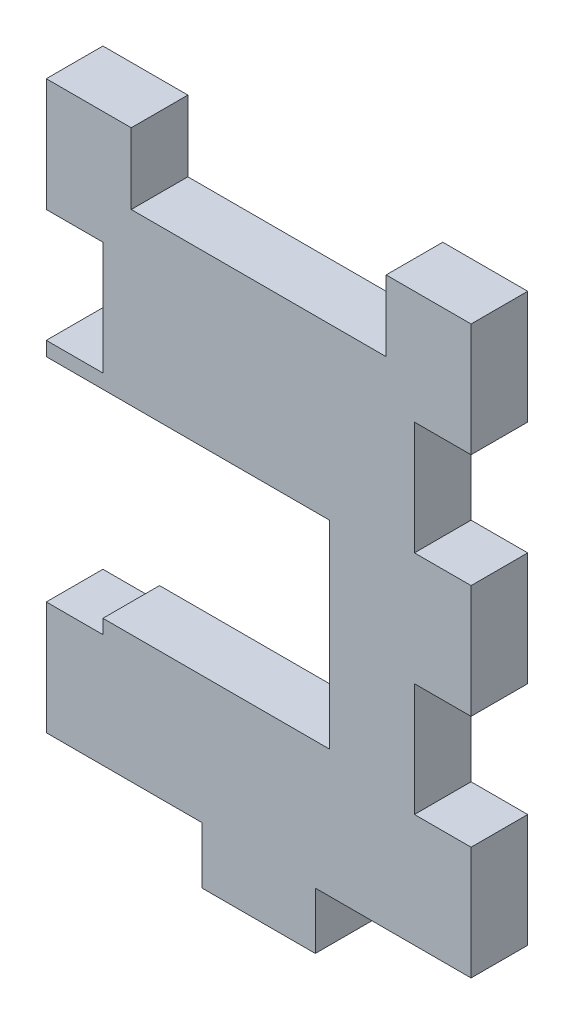
ISO-10303-21;
HEADER;
FILE_DESCRIPTION(('STEP AP214'),'2;1');
FILE_NAME('part.step','',(''),(''),'','','');
FILE_SCHEMA(('AUTOMOTIVE_DESIGN { 1 0 10303 214 1 1 1 1 }'));
ENDSEC;
DATA;
#1=APPLICATION_CONTEXT('core data for automotive mechanical design processes');
#2=APPLICATION_PROTOCOL_DEFINITION('international standard','automotive_design',2000,#1);
#3=PRODUCT_CONTEXT('',#1,'mechanical');
#4=PRODUCT('Part','Part','',(#3));
#5=PRODUCT_RELATED_PRODUCT_CATEGORY('part','',(#4));
#6=PRODUCT_DEFINITION_FORMATION('','',#4);
#7=PRODUCT_DEFINITION_CONTEXT('part definition',#1,'design');
#8=PRODUCT_DEFINITION('design','',#6,#7);
#9=PRODUCT_DEFINITION_SHAPE('','',#8);
#10=(LENGTH_UNIT() NAMED_UNIT(*) SI_UNIT(.MILLI.,.METRE.));
#11=(NAMED_UNIT(*) PLANE_ANGLE_UNIT() SI_UNIT($,.RADIAN.));
#12=(NAMED_UNIT(*) SI_UNIT($,.STERADIAN.) SOLID_ANGLE_UNIT());
#13=UNCERTAINTY_MEASURE_WITH_UNIT(LENGTH_MEASURE(1.E-05),#10,'distance_accuracy_value','');
#14=(GEOMETRIC_REPRESENTATION_CONTEXT(3) GLOBAL_UNCERTAINTY_ASSIGNED_CONTEXT((#13)) GLOBAL_UNIT_ASSIGNED_CONTEXT((#10,
#11,#12)) REPRESENTATION_CONTEXT('',''));
#15=CARTESIAN_POINT('',(0.,0.,0.));
#16=DIRECTION('',(0.,0.,1.));
#17=DIRECTION('',(1.,0.,0.));
#18=AXIS2_PLACEMENT_3D('',#15,#16,#17);
#19=CARTESIAN_POINT('',(0.,69.85,6.35));
#20=DIRECTION('',(0.,-1.,0.));
#21=DIRECTION('',(0.,0.,-1.));
#22=AXIS2_PLACEMENT_3D('',#19,#20,#21);
#23=PLANE('',#22);
#24=DIRECTION('',(-1.,0.,0.));
#25=VECTOR('',#24,1.);
#26=CARTESIAN_POINT('',(0.,69.85,0.));
#27=LINE('',#26,#25);
#28=CARTESIAN_POINT('',(47.625,69.85,0.));
#29=VERTEX_POINT('',#28);
#30=CARTESIAN_POINT('',(38.1,69.85,0.));
#31=VERTEX_POINT('',#30);
#32=EDGE_CURVE('E436',#29,#31,#27,.T.);
#33=ORIENTED_EDGE('',*,*,#32,.T.);
#34=DIRECTION('',(0.,0.,1.));
#35=VECTOR('',#34,1.);
#36=CARTESIAN_POINT('',(38.1,69.85,6.35));
#37=LINE('',#36,#35);
#38=CARTESIAN_POINT('',(38.1,69.85,6.35));
#39=VERTEX_POINT('',#38);
#40=EDGE_CURVE('E242',#31,#39,#37,.T.);
#41=ORIENTED_EDGE('',*,*,#40,.T.);
#42=DIRECTION('',(-1.,0.,0.));
#43=VECTOR('',#42,1.);
#44=CARTESIAN_POINT('',(0.,69.85,6.35));
#45=LINE('',#44,#43);
#46=CARTESIAN_POINT('',(47.625,69.85,6.35));
#47=VERTEX_POINT('',#46);
#48=EDGE_CURVE('E418',#47,#39,#45,.T.);
#49=ORIENTED_EDGE('',*,*,#48,.F.);
#50=DIRECTION('',(0.,0.,-1.));
#51=VECTOR('',#50,1.);
#52=CARTESIAN_POINT('',(47.625,69.85,6.35));
#53=LINE('',#52,#51);
#54=EDGE_CURVE('E440',#47,#29,#53,.T.);
#55=ORIENTED_EDGE('',*,*,#54,.T.);
#56=EDGE_LOOP('',(#33,#41,#49,#55));
#57=FACE_BOUND('',#56,.T.);
#58=ADVANCED_FACE('F33',(#57),#23,.F.);
#59=CARTESIAN_POINT('',(47.625,6.35000000000003,6.35));
#60=DIRECTION('',(-1.,0.,0.));
#61=DIRECTION('',(0.,-1.,0.));
#62=AXIS2_PLACEMENT_3D('',#59,#60,#61);
#63=PLANE('',#62);
#64=DIRECTION('',(0.,1.,0.));
#65=VECTOR('',#64,1.);
#66=CARTESIAN_POINT('',(47.625,6.35000000000003,0.));
#67=LINE('',#66,#65);
#68=CARTESIAN_POINT('',(47.625,31.75,0.));
#69=VERTEX_POINT('',#68);
#70=CARTESIAN_POINT('',(47.625,44.45,0.));
#71=VERTEX_POINT('',#70);
#72=EDGE_CURVE('E435',#69,#71,#67,.T.);
#73=ORIENTED_EDGE('',*,*,#72,.T.);
#74=DIRECTION('',(0.,0.,1.));
#75=VECTOR('',#74,1.);
#76=CARTESIAN_POINT('',(47.625,44.45,0.));
#77=LINE('',#76,#75);
#78=CARTESIAN_POINT('',(47.625,44.45,6.35));
#79=VERTEX_POINT('',#78);
#80=EDGE_CURVE('E301',#71,#79,#77,.T.);
#81=ORIENTED_EDGE('',*,*,#80,.T.);
#82=DIRECTION('',(0.,1.,0.));
#83=VECTOR('',#82,1.);
#84=CARTESIAN_POINT('',(47.625,6.35000000000003,6.35));
#85=LINE('',#84,#83);
#86=CARTESIAN_POINT('',(47.625,31.75,6.35));
#87=VERTEX_POINT('',#86);
#88=EDGE_CURVE('E417',#87,#79,#85,.T.);
#89=ORIENTED_EDGE('',*,*,#88,.F.);
#90=DIRECTION('',(0.,0.,1.));
#91=VECTOR('',#90,1.);
#92=CARTESIAN_POINT('',(47.625,31.75,0.));
#93=LINE('',#92,#91);
#94=EDGE_CURVE('E346',#69,#87,#93,.T.);
#95=ORIENTED_EDGE('',*,*,#94,.F.);
#96=EDGE_LOOP('',(#73,#81,#89,#95));
#97=FACE_BOUND('',#96,.T.);
#98=ADVANCED_FACE('F494',(#97),#63,.F.);
#99=CARTESIAN_POINT('',(0.,6.35000000000003,6.35));
#100=DIRECTION('',(1.,0.,0.));
#101=DIRECTION('',(0.,1.,0.));
#102=AXIS2_PLACEMENT_3D('',#99,#100,#101);
#103=PLANE('',#102);
#104=DIRECTION('',(0.,-1.,0.));
#105=VECTOR('',#104,1.);
#106=CARTESIAN_POINT('',(0.,6.35000000000003,0.));
#107=LINE('',#106,#105);
#108=CARTESIAN_POINT('',(0.,69.85,0.));
#109=VERTEX_POINT('',#108);
#110=CARTESIAN_POINT('',(0.,57.15,0.));
#111=VERTEX_POINT('',#110);
#112=EDGE_CURVE('E422',#109,#111,#107,.T.);
#113=ORIENTED_EDGE('',*,*,#112,.T.);
#114=DIRECTION('',(0.,0.,1.));
#115=VECTOR('',#114,1.);
#116=CARTESIAN_POINT('',(0.,57.15,0.));
#117=LINE('',#116,#115);
#118=CARTESIAN_POINT('',(0.,57.15,6.35));
#119=VERTEX_POINT('',#118);
#120=EDGE_CURVE('E327',#111,#119,#117,.T.);
#121=ORIENTED_EDGE('',*,*,#120,.T.);
#122=DIRECTION('',(0.,-1.,0.));
#123=VECTOR('',#122,1.);
#124=CARTESIAN_POINT('',(0.,6.35000000000003,6.35));
#125=LINE('',#124,#123);
#126=CARTESIAN_POINT('',(0.,69.85,6.35));
#127=VERTEX_POINT('',#126);
#128=EDGE_CURVE('E403',#127,#119,#125,.T.);
#129=ORIENTED_EDGE('',*,*,#128,.F.);
#130=DIRECTION('',(0.,0.,-1.));
#131=VECTOR('',#130,1.);
#132=CARTESIAN_POINT('',(0.,69.85,6.35));
#133=LINE('',#132,#131);
#134=EDGE_CURVE('E421',#127,#109,#133,.T.);
#135=ORIENTED_EDGE('',*,*,#134,.T.);
#136=EDGE_LOOP('',(#113,#121,#129,#135));
#137=FACE_BOUND('',#136,.T.);
#138=ADVANCED_FACE('F503',(#137),#103,.F.);
#139=CARTESIAN_POINT('',(47.625,6.35000000000003,0.));
#140=VERTEX_POINT('',#139);
#141=CARTESIAN_POINT('',(47.625,19.05,0.));
#142=VERTEX_POINT('',#141);
#143=EDGE_CURVE('E431',#140,#142,#67,.T.);
#144=ORIENTED_EDGE('',*,*,#143,.T.);
#145=DIRECTION('',(0.,0.,1.));
#146=VECTOR('',#145,1.);
#147=CARTESIAN_POINT('',(47.625,19.05,0.));
#148=LINE('',#147,#146);
#149=CARTESIAN_POINT('',(47.625,19.05,6.35));
#150=VERTEX_POINT('',#149);
#151=EDGE_CURVE('E353',#142,#150,#148,.T.);
#152=ORIENTED_EDGE('',*,*,#151,.T.);
#153=CARTESIAN_POINT('',(47.625,6.35000000000003,6.35));
#154=VERTEX_POINT('',#153);
#155=EDGE_CURVE('E413',#154,#150,#85,.T.);
#156=ORIENTED_EDGE('',*,*,#155,.F.);
#157=DIRECTION('',(0.,0.,-1.));
#158=VECTOR('',#157,1.);
#159=CARTESIAN_POINT('',(47.625,6.35000000000003,6.35));
#160=LINE('',#159,#158);
#161=EDGE_CURVE('E443',#154,#140,#160,.T.);
#162=ORIENTED_EDGE('',*,*,#161,.T.);
#163=EDGE_LOOP('',(#144,#152,#156,#162));
#164=FACE_BOUND('',#163,.T.);
#165=ADVANCED_FACE('F506',(#164),#63,.F.);
#166=CARTESIAN_POINT('',(0.,44.45,0.));
#167=VERTEX_POINT('',#166);
#168=CARTESIAN_POINT('',(0.,42.8625,0.));
#169=VERTEX_POINT('',#168);
#170=EDGE_CURVE('E426',#167,#169,#107,.T.);
#171=ORIENTED_EDGE('',*,*,#170,.T.);
#172=DIRECTION('',(0.,0.,1.));
#173=VECTOR('',#172,1.);
#174=CARTESIAN_POINT('',(0.,42.8625,6.35));
#175=LINE('',#174,#173);
#176=CARTESIAN_POINT('',(0.,42.8625,6.35));
#177=VERTEX_POINT('',#176);
#178=EDGE_CURVE('E279',#169,#177,#175,.T.);
#179=ORIENTED_EDGE('',*,*,#178,.T.);
#180=CARTESIAN_POINT('',(0.,44.45,6.35));
#181=VERTEX_POINT('',#180);
#182=EDGE_CURVE('E407',#181,#177,#125,.T.);
#183=ORIENTED_EDGE('',*,*,#182,.F.);
#184=DIRECTION('',(0.,0.,1.));
#185=VECTOR('',#184,1.);
#186=CARTESIAN_POINT('',(0.,44.45,0.));
#187=LINE('',#186,#185);
#188=EDGE_CURVE('E320',#167,#181,#187,.T.);
#189=ORIENTED_EDGE('',*,*,#188,.F.);
#190=EDGE_LOOP('',(#171,#179,#183,#189));
#191=FACE_BOUND('',#190,.T.);
#192=ADVANCED_FACE('F474',(#191),#103,.F.);
#193=CARTESIAN_POINT('',(0.,6.35000000000003,6.35));
#194=DIRECTION('',(0.,1.,0.));
#195=DIRECTION('',(0.,0.,1.));
#196=AXIS2_PLACEMENT_3D('',#193,#194,#195);
#197=PLANE('',#196);
#198=DIRECTION('',(1.,0.,0.));
#199=VECTOR('',#198,1.);
#200=CARTESIAN_POINT('',(0.,6.35000000000003,0.));
#201=LINE('',#200,#199);
#202=CARTESIAN_POINT('',(0.,6.35000000000003,0.));
#203=VERTEX_POINT('',#202);
#204=CARTESIAN_POINT('',(17.4625,6.35000000000003,0.));
#205=VERTEX_POINT('',#204);
#206=EDGE_CURVE('E427',#203,#205,#201,.T.);
#207=ORIENTED_EDGE('',*,*,#206,.T.);
#208=DIRECTION('',(0.,0.,1.));
#209=VECTOR('',#208,1.);
#210=CARTESIAN_POINT('',(17.4625,6.35000000000003,6.35));
#211=LINE('',#210,#209);
#212=CARTESIAN_POINT('',(17.4625,6.35000000000003,6.35));
#213=VERTEX_POINT('',#212);
#214=EDGE_CURVE('E399',#205,#213,#211,.T.);
#215=ORIENTED_EDGE('',*,*,#214,.T.);
#216=DIRECTION('',(1.,0.,0.));
#217=VECTOR('',#216,1.);
#218=CARTESIAN_POINT('',(0.,6.35000000000003,6.35));
#219=LINE('',#218,#217);
#220=CARTESIAN_POINT('',(0.,6.35000000000003,6.35));
#221=VERTEX_POINT('',#220);
#222=EDGE_CURVE('E409',#221,#213,#219,.T.);
#223=ORIENTED_EDGE('',*,*,#222,.F.);
#224=DIRECTION('',(0.,0.,-1.));
#225=VECTOR('',#224,1.);
#226=CARTESIAN_POINT('',(0.,6.35000000000003,6.35));
#227=LINE('',#226,#225);
#228=EDGE_CURVE('E446',#221,#203,#227,.T.);
#229=ORIENTED_EDGE('',*,*,#228,.T.);
#230=EDGE_LOOP('',(#207,#215,#223,#229));
#231=FACE_BOUND('',#230,.T.);
#232=ADVANCED_FACE('F575',(#231),#197,.F.);
#233=CARTESIAN_POINT('',(0.,19.05,6.35));
#234=VERTEX_POINT('',#233);
#235=EDGE_CURVE('E408',#234,#221,#125,.T.);
#236=ORIENTED_EDGE('',*,*,#235,.F.);
#237=DIRECTION('',(0.,0.,1.));
#238=VECTOR('',#237,1.);
#239=CARTESIAN_POINT('',(0.,19.05,0.));
#240=LINE('',#239,#238);
#241=CARTESIAN_POINT('',(0.,19.05,0.));
#242=VERTEX_POINT('',#241);
#243=EDGE_CURVE('E369',#242,#234,#240,.T.);
#244=ORIENTED_EDGE('',*,*,#243,.F.);
#245=EDGE_CURVE('E402',#242,#203,#107,.T.);
#246=ORIENTED_EDGE('',*,*,#245,.T.);
#247=ORIENTED_EDGE('',*,*,#228,.F.);
#248=EDGE_LOOP('',(#236,#244,#246,#247));
#249=FACE_BOUND('',#248,.T.);
#250=ADVANCED_FACE('F35',(#249),#103,.F.);
#251=CARTESIAN_POINT('',(30.1625,6.35000000000003,6.35));
#252=VERTEX_POINT('',#251);
#253=EDGE_CURVE('E406',#252,#154,#219,.T.);
#254=ORIENTED_EDGE('',*,*,#253,.F.);
#255=DIRECTION('',(0.,0.,-1.));
#256=VECTOR('',#255,1.);
#257=CARTESIAN_POINT('',(30.1625,6.35000000000003,6.35));
#258=LINE('',#257,#256);
#259=CARTESIAN_POINT('',(30.1625,6.35000000000003,0.));
#260=VERTEX_POINT('',#259);
#261=EDGE_CURVE('E394',#252,#260,#258,.T.);
#262=ORIENTED_EDGE('',*,*,#261,.T.);
#263=EDGE_CURVE('E425',#260,#140,#201,.T.);
#264=ORIENTED_EDGE('',*,*,#263,.T.);
#265=ORIENTED_EDGE('',*,*,#161,.F.);
#266=EDGE_LOOP('',(#254,#262,#264,#265));
#267=FACE_BOUND('',#266,.T.);
#268=ADVANCED_FACE('F515',(#267),#197,.F.);
#269=CARTESIAN_POINT('',(47.625,57.15,6.35));
#270=VERTEX_POINT('',#269);
#271=EDGE_CURVE('E412',#270,#47,#85,.T.);
#272=ORIENTED_EDGE('',*,*,#271,.F.);
#273=DIRECTION('',(0.,0.,1.));
#274=VECTOR('',#273,1.);
#275=CARTESIAN_POINT('',(47.625,57.15,0.));
#276=LINE('',#275,#274);
#277=CARTESIAN_POINT('',(47.625,57.15,0.));
#278=VERTEX_POINT('',#277);
#279=EDGE_CURVE('E294',#278,#270,#276,.T.);
#280=ORIENTED_EDGE('',*,*,#279,.F.);
#281=EDGE_CURVE('E430',#278,#29,#67,.T.);
#282=ORIENTED_EDGE('',*,*,#281,.T.);
#283=ORIENTED_EDGE('',*,*,#54,.F.);
#284=EDGE_LOOP('',(#272,#280,#282,#283));
#285=FACE_BOUND('',#284,.T.);
#286=ADVANCED_FACE('F507',(#285),#63,.F.);
#287=CARTESIAN_POINT('',(9.525,69.85,6.35));
#288=VERTEX_POINT('',#287);
#289=EDGE_CURVE('E416',#288,#127,#45,.T.);
#290=ORIENTED_EDGE('',*,*,#289,.F.);
#291=DIRECTION('',(0.,0.,-1.));
#292=VECTOR('',#291,1.);
#293=CARTESIAN_POINT('',(9.525,69.85,6.35));
#294=LINE('',#293,#292);
#295=CARTESIAN_POINT('',(9.525,69.85,0.));
#296=VERTEX_POINT('',#295);
#297=EDGE_CURVE('E235',#288,#296,#294,.T.);
#298=ORIENTED_EDGE('',*,*,#297,.T.);
#299=EDGE_CURVE('E434',#296,#109,#27,.T.);
#300=ORIENTED_EDGE('',*,*,#299,.T.);
#301=ORIENTED_EDGE('',*,*,#134,.F.);
#302=EDGE_LOOP('',(#290,#298,#300,#301));
#303=FACE_BOUND('',#302,.T.);
#304=ADVANCED_FACE('F497',(#303),#23,.F.);
#305=CARTESIAN_POINT('',(0.,0.,6.35));
#306=DIRECTION('',(0.,0.,-1.));
#307=DIRECTION('',(-1.,0.,0.));
#308=AXIS2_PLACEMENT_3D('',#305,#306,#307);
#309=PLANE('',#308);
#310=ORIENTED_EDGE('',*,*,#48,.T.);
#311=DIRECTION('',(0.,1.,0.));
#312=VECTOR('',#311,1.);
#313=CARTESIAN_POINT('',(38.1,61.9125,6.35));
#314=LINE('',#313,#312);
#315=CARTESIAN_POINT('',(38.1,61.9125,6.35));
#316=VERTEX_POINT('',#315);
#317=EDGE_CURVE('E253',#316,#39,#314,.T.);
#318=ORIENTED_EDGE('',*,*,#317,.F.);
#319=DIRECTION('',(1.,0.,0.));
#320=VECTOR('',#319,1.);
#321=CARTESIAN_POINT('',(9.525,61.9125,6.35));
#322=LINE('',#321,#320);
#323=CARTESIAN_POINT('',(9.525,61.9125,6.35));
#324=VERTEX_POINT('',#323);
#325=EDGE_CURVE('E232',#324,#316,#322,.T.);
#326=ORIENTED_EDGE('',*,*,#325,.F.);
#327=DIRECTION('',(0.,-1.,0.));
#328=VECTOR('',#327,1.);
#329=CARTESIAN_POINT('',(9.525,61.9125,6.35));
#330=LINE('',#329,#328);
#331=EDGE_CURVE('E255',#288,#324,#330,.T.);
#332=ORIENTED_EDGE('',*,*,#331,.F.);
#333=ORIENTED_EDGE('',*,*,#289,.T.);
#334=ORIENTED_EDGE('',*,*,#128,.T.);
#335=DIRECTION('',(-1.,0.,0.));
#336=VECTOR('',#335,1.);
#337=CARTESIAN_POINT('',(0.,57.15,6.35));
#338=LINE('',#337,#336);
#339=CARTESIAN_POINT('',(6.35,57.15,6.35));
#340=VERTEX_POINT('',#339);
#341=EDGE_CURVE('E314',#340,#119,#338,.T.);
#342=ORIENTED_EDGE('',*,*,#341,.F.);
#343=DIRECTION('',(0.,1.,0.));
#344=VECTOR('',#343,1.);
#345=CARTESIAN_POINT('',(6.35,44.45,6.35));
#346=LINE('',#345,#344);
#347=CARTESIAN_POINT('',(6.35,44.45,6.35));
#348=VERTEX_POINT('',#347);
#349=EDGE_CURVE('E323',#348,#340,#346,.T.);
#350=ORIENTED_EDGE('',*,*,#349,.F.);
#351=DIRECTION('',(1.,0.,0.));
#352=VECTOR('',#351,1.);
#353=CARTESIAN_POINT('',(0.,44.45,6.35));
#354=LINE('',#353,#352);
#355=EDGE_CURVE('E304',#181,#348,#354,.T.);
#356=ORIENTED_EDGE('',*,*,#355,.F.);
#357=ORIENTED_EDGE('',*,*,#182,.T.);
#358=DIRECTION('',(-1.,0.,0.));
#359=VECTOR('',#358,1.);
#360=CARTESIAN_POINT('',(-19.05,42.8625,6.35));
#361=LINE('',#360,#359);
#362=CARTESIAN_POINT('',(31.75,42.8625,6.35));
#363=VERTEX_POINT('',#362);
#364=EDGE_CURVE('E273',#363,#177,#361,.T.);
#365=ORIENTED_EDGE('',*,*,#364,.F.);
#366=DIRECTION('',(0.,1.,0.));
#367=VECTOR('',#366,1.);
#368=CARTESIAN_POINT('',(31.75,20.6375,6.35));
#369=LINE('',#368,#367);
#370=CARTESIAN_POINT('',(31.75,20.6375,6.35));
#371=VERTEX_POINT('',#370);
#372=EDGE_CURVE('E261',#371,#363,#369,.T.);
#373=ORIENTED_EDGE('',*,*,#372,.F.);
#374=DIRECTION('',(1.,0.,0.));
#375=VECTOR('',#374,1.);
#376=CARTESIAN_POINT('',(-19.05,20.6375,6.35));
#377=LINE('',#376,#375);
#378=CARTESIAN_POINT('',(6.35,20.6375,6.35));
#379=VERTEX_POINT('',#378);
#380=EDGE_CURVE('E266',#379,#371,#377,.T.);
#381=ORIENTED_EDGE('',*,*,#380,.F.);
#382=DIRECTION('',(0.,1.,0.));
#383=VECTOR('',#382,1.);
#384=CARTESIAN_POINT('',(6.35,19.05,6.35));
#385=LINE('',#384,#383);
#386=CARTESIAN_POINT('',(6.35,19.05,6.35));
#387=VERTEX_POINT('',#386);
#388=EDGE_CURVE('E366',#387,#379,#385,.T.);
#389=ORIENTED_EDGE('',*,*,#388,.F.);
#390=DIRECTION('',(1.,0.,0.));
#391=VECTOR('',#390,1.);
#392=CARTESIAN_POINT('',(0.,19.05,6.35));
#393=LINE('',#392,#391);
#394=EDGE_CURVE('E356',#234,#387,#393,.T.);
#395=ORIENTED_EDGE('',*,*,#394,.F.);
#396=ORIENTED_EDGE('',*,*,#235,.T.);
#397=ORIENTED_EDGE('',*,*,#222,.T.);
#398=DIRECTION('',(0.,-1.,0.));
#399=VECTOR('',#398,1.);
#400=CARTESIAN_POINT('',(17.4625,0.,6.35));
#401=LINE('',#400,#399);
#402=CARTESIAN_POINT('',(17.4625,0.,6.35));
#403=VERTEX_POINT('',#402);
#404=EDGE_CURVE('E376',#213,#403,#401,.T.);
#405=ORIENTED_EDGE('',*,*,#404,.T.);
#406=DIRECTION('',(1.,0.,0.));
#407=VECTOR('',#406,1.);
#408=CARTESIAN_POINT('',(30.1625,0.,6.35));
#409=LINE('',#408,#407);
#410=CARTESIAN_POINT('',(30.1625,0.,6.35));
#411=VERTEX_POINT('',#410);
#412=EDGE_CURVE('E388',#403,#411,#409,.T.);
#413=ORIENTED_EDGE('',*,*,#412,.T.);
#414=DIRECTION('',(0.,1.,0.));
#415=VECTOR('',#414,1.);
#416=CARTESIAN_POINT('',(30.1625,0.,6.35));
#417=LINE('',#416,#415);
#418=EDGE_CURVE('E381',#411,#252,#417,.T.);
#419=ORIENTED_EDGE('',*,*,#418,.T.);
#420=ORIENTED_EDGE('',*,*,#253,.T.);
#421=ORIENTED_EDGE('',*,*,#155,.T.);
#422=DIRECTION('',(1.,0.,0.));
#423=VECTOR('',#422,1.);
#424=CARTESIAN_POINT('',(47.625,19.05,6.35));
#425=LINE('',#424,#423);
#426=CARTESIAN_POINT('',(41.275,19.05,6.35));
#427=VERTEX_POINT('',#426);
#428=EDGE_CURVE('E340',#427,#150,#425,.T.);
#429=ORIENTED_EDGE('',*,*,#428,.F.);
#430=DIRECTION('',(0.,-1.,0.));
#431=VECTOR('',#430,1.);
#432=CARTESIAN_POINT('',(41.275,19.05,6.35));
#433=LINE('',#432,#431);
#434=CARTESIAN_POINT('',(41.275,31.75,6.35));
#435=VERTEX_POINT('',#434);
#436=EDGE_CURVE('E349',#435,#427,#433,.T.);
#437=ORIENTED_EDGE('',*,*,#436,.F.);
#438=DIRECTION('',(-1.,0.,0.));
#439=VECTOR('',#438,1.);
#440=CARTESIAN_POINT('',(47.625,31.75,6.35));
#441=LINE('',#440,#439);
#442=EDGE_CURVE('E330',#87,#435,#441,.T.);
#443=ORIENTED_EDGE('',*,*,#442,.F.);
#444=ORIENTED_EDGE('',*,*,#88,.T.);
#445=DIRECTION('',(1.,0.,0.));
#446=VECTOR('',#445,1.);
#447=CARTESIAN_POINT('',(47.625,44.45,6.35));
#448=LINE('',#447,#446);
#449=CARTESIAN_POINT('',(41.275,44.45,6.35));
#450=VERTEX_POINT('',#449);
#451=EDGE_CURVE('E288',#450,#79,#448,.T.);
#452=ORIENTED_EDGE('',*,*,#451,.F.);
#453=DIRECTION('',(0.,-1.,0.));
#454=VECTOR('',#453,1.);
#455=CARTESIAN_POINT('',(41.275,44.45,6.35));
#456=LINE('',#455,#454);
#457=CARTESIAN_POINT('',(41.275,57.15,6.35));
#458=VERTEX_POINT('',#457);
#459=EDGE_CURVE('E297',#458,#450,#456,.T.);
#460=ORIENTED_EDGE('',*,*,#459,.F.);
#461=DIRECTION('',(-1.,0.,0.));
#462=VECTOR('',#461,1.);
#463=CARTESIAN_POINT('',(47.625,57.15,6.35));
#464=LINE('',#463,#462);
#465=EDGE_CURVE('E283',#270,#458,#464,.T.);
#466=ORIENTED_EDGE('',*,*,#465,.F.);
#467=ORIENTED_EDGE('',*,*,#271,.T.);
#468=EDGE_LOOP('',(#310,#318,#326,#332,#333,#334,#342,#350,#356,#357,#365,#373,#381,#389,#395,
#396,#397,#405,#413,#419,#420,#421,#429,#437,#443,#444,#452,#460,#466,#467));
#469=FACE_BOUND('',#468,.T.);
#470=ADVANCED_FACE('F468',(#469),#309,.F.);
#471=CARTESIAN_POINT('',(0.,0.,0.));
#472=DIRECTION('',(0.,0.,-1.));
#473=DIRECTION('',(-1.,0.,0.));
#474=AXIS2_PLACEMENT_3D('',#471,#472,#473);
#475=PLANE('',#474);
#476=DIRECTION('',(0.,1.,0.));
#477=VECTOR('',#476,1.);
#478=CARTESIAN_POINT('',(38.1,61.9125,0.));
#479=LINE('',#478,#477);
#480=CARTESIAN_POINT('',(38.1,61.9125,0.));
#481=VERTEX_POINT('',#480);
#482=EDGE_CURVE('E239',#481,#31,#479,.T.);
#483=ORIENTED_EDGE('',*,*,#482,.T.);
#484=ORIENTED_EDGE('',*,*,#32,.F.);
#485=ORIENTED_EDGE('',*,*,#281,.F.);
#486=DIRECTION('',(-1.,0.,0.));
#487=VECTOR('',#486,1.);
#488=CARTESIAN_POINT('',(47.625,57.15,0.));
#489=LINE('',#488,#487);
#490=CARTESIAN_POINT('',(41.275,57.15,0.));
#491=VERTEX_POINT('',#490);
#492=EDGE_CURVE('E284',#278,#491,#489,.T.);
#493=ORIENTED_EDGE('',*,*,#492,.T.);
#494=DIRECTION('',(0.,-1.,0.));
#495=VECTOR('',#494,1.);
#496=CARTESIAN_POINT('',(41.275,44.45,0.));
#497=LINE('',#496,#495);
#498=CARTESIAN_POINT('',(41.275,44.45,0.));
#499=VERTEX_POINT('',#498);
#500=EDGE_CURVE('E287',#491,#499,#497,.T.);
#501=ORIENTED_EDGE('',*,*,#500,.T.);
#502=DIRECTION('',(1.,0.,0.));
#503=VECTOR('',#502,1.);
#504=CARTESIAN_POINT('',(47.625,44.45,0.));
#505=LINE('',#504,#503);
#506=EDGE_CURVE('E291',#499,#71,#505,.T.);
#507=ORIENTED_EDGE('',*,*,#506,.T.);
#508=ORIENTED_EDGE('',*,*,#72,.F.);
#509=DIRECTION('',(-1.,0.,0.));
#510=VECTOR('',#509,1.);
#511=CARTESIAN_POINT('',(47.625,31.75,0.));
#512=LINE('',#511,#510);
#513=CARTESIAN_POINT('',(41.275,31.75,0.));
#514=VERTEX_POINT('',#513);
#515=EDGE_CURVE('E336',#69,#514,#512,.T.);
#516=ORIENTED_EDGE('',*,*,#515,.T.);
#517=DIRECTION('',(0.,-1.,0.));
#518=VECTOR('',#517,1.);
#519=CARTESIAN_POINT('',(41.275,19.05,0.));
#520=LINE('',#519,#518);
#521=CARTESIAN_POINT('',(41.275,19.05,0.));
#522=VERTEX_POINT('',#521);
#523=EDGE_CURVE('E339',#514,#522,#520,.T.);
#524=ORIENTED_EDGE('',*,*,#523,.T.);
#525=DIRECTION('',(1.,0.,0.));
#526=VECTOR('',#525,1.);
#527=CARTESIAN_POINT('',(47.625,19.05,0.));
#528=LINE('',#527,#526);
#529=EDGE_CURVE('E343',#522,#142,#528,.T.);
#530=ORIENTED_EDGE('',*,*,#529,.T.);
#531=ORIENTED_EDGE('',*,*,#143,.F.);
#532=ORIENTED_EDGE('',*,*,#263,.F.);
#533=DIRECTION('',(0.,1.,0.));
#534=VECTOR('',#533,1.);
#535=CARTESIAN_POINT('',(30.1625,0.,0.));
#536=LINE('',#535,#534);
#537=CARTESIAN_POINT('',(30.1625,0.,0.));
#538=VERTEX_POINT('',#537);
#539=EDGE_CURVE('E384',#538,#260,#536,.T.);
#540=ORIENTED_EDGE('',*,*,#539,.F.);
#541=DIRECTION('',(1.,0.,0.));
#542=VECTOR('',#541,1.);
#543=CARTESIAN_POINT('',(30.1625,0.,0.));
#544=LINE('',#543,#542);
#545=CARTESIAN_POINT('',(17.4625,0.,0.));
#546=VERTEX_POINT('',#545);
#547=EDGE_CURVE('E380',#546,#538,#544,.T.);
#548=ORIENTED_EDGE('',*,*,#547,.F.);
#549=DIRECTION('',(0.,-1.,0.));
#550=VECTOR('',#549,1.);
#551=CARTESIAN_POINT('',(17.4625,0.,0.));
#552=LINE('',#551,#550);
#553=EDGE_CURVE('E378',#205,#546,#552,.T.);
#554=ORIENTED_EDGE('',*,*,#553,.F.);
#555=ORIENTED_EDGE('',*,*,#206,.F.);
#556=ORIENTED_EDGE('',*,*,#245,.F.);
#557=DIRECTION('',(1.,0.,0.));
#558=VECTOR('',#557,1.);
#559=CARTESIAN_POINT('',(0.,19.05,0.));
#560=LINE('',#559,#558);
#561=CARTESIAN_POINT('',(6.35,19.05,0.));
#562=VERTEX_POINT('',#561);
#563=EDGE_CURVE('E362',#242,#562,#560,.T.);
#564=ORIENTED_EDGE('',*,*,#563,.T.);
#565=DIRECTION('',(0.,1.,0.));
#566=VECTOR('',#565,1.);
#567=CARTESIAN_POINT('',(6.35,19.05,0.));
#568=LINE('',#567,#566);
#569=CARTESIAN_POINT('',(6.35,20.6375,0.));
#570=VERTEX_POINT('',#569);
#571=EDGE_CURVE('E365',#562,#570,#568,.T.);
#572=ORIENTED_EDGE('',*,*,#571,.T.);
#573=DIRECTION('',(1.,0.,0.));
#574=VECTOR('',#573,1.);
#575=CARTESIAN_POINT('',(-19.05,20.6375,0.));
#576=LINE('',#575,#574);
#577=CARTESIAN_POINT('',(31.75,20.6375,0.));
#578=VERTEX_POINT('',#577);
#579=EDGE_CURVE('E56',#570,#578,#576,.T.);
#580=ORIENTED_EDGE('',*,*,#579,.T.);
#581=DIRECTION('',(0.,1.,0.));
#582=VECTOR('',#581,1.);
#583=CARTESIAN_POINT('',(31.75,20.6375,0.));
#584=LINE('',#583,#582);
#585=CARTESIAN_POINT('',(31.75,42.8625,0.));
#586=VERTEX_POINT('',#585);
#587=EDGE_CURVE('E262',#578,#586,#584,.T.);
#588=ORIENTED_EDGE('',*,*,#587,.T.);
#589=DIRECTION('',(-1.,0.,0.));
#590=VECTOR('',#589,1.);
#591=CARTESIAN_POINT('',(-19.05,42.8625,0.));
#592=LINE('',#591,#590);
#593=EDGE_CURVE('E265',#586,#169,#592,.T.);
#594=ORIENTED_EDGE('',*,*,#593,.T.);
#595=ORIENTED_EDGE('',*,*,#170,.F.);
#596=DIRECTION('',(1.,0.,0.));
#597=VECTOR('',#596,1.);
#598=CARTESIAN_POINT('',(0.,44.45,0.));
#599=LINE('',#598,#597);
#600=CARTESIAN_POINT('',(6.35,44.45,0.));
#601=VERTEX_POINT('',#600);
#602=EDGE_CURVE('E310',#167,#601,#599,.T.);
#603=ORIENTED_EDGE('',*,*,#602,.T.);
#604=DIRECTION('',(0.,1.,0.));
#605=VECTOR('',#604,1.);
#606=CARTESIAN_POINT('',(6.35,44.45,0.));
#607=LINE('',#606,#605);
#608=CARTESIAN_POINT('',(6.35,57.15,0.));
#609=VERTEX_POINT('',#608);
#610=EDGE_CURVE('E313',#601,#609,#607,.T.);
#611=ORIENTED_EDGE('',*,*,#610,.T.);
#612=DIRECTION('',(-1.,0.,0.));
#613=VECTOR('',#612,1.);
#614=CARTESIAN_POINT('',(0.,57.15,0.));
#615=LINE('',#614,#613);
#616=EDGE_CURVE('E317',#609,#111,#615,.T.);
#617=ORIENTED_EDGE('',*,*,#616,.T.);
#618=ORIENTED_EDGE('',*,*,#112,.F.);
#619=ORIENTED_EDGE('',*,*,#299,.F.);
#620=DIRECTION('',(0.,1.,0.));
#621=VECTOR('',#620,1.);
#622=CARTESIAN_POINT('',(9.525,0.,0.));
#623=LINE('',#622,#621);
#624=CARTESIAN_POINT('',(9.525,61.9125,0.));
#625=VERTEX_POINT('',#624);
#626=EDGE_CURVE('E11',#625,#296,#623,.T.);
#627=ORIENTED_EDGE('',*,*,#626,.F.);
#628=DIRECTION('',(1.,0.,0.));
#629=VECTOR('',#628,1.);
#630=CARTESIAN_POINT('',(9.525,61.9125,0.));
#631=LINE('',#630,#629);
#632=EDGE_CURVE('E48',#625,#481,#631,.T.);
#633=ORIENTED_EDGE('',*,*,#632,.T.);
#634=EDGE_LOOP('',(#483,#484,#485,#493,#501,#507,#508,#516,#524,#530,#531,#532,#540,#548,#554,
#555,#556,#564,#572,#580,#588,#594,#595,#603,#611,#617,#618,#619,#627,#633));
#635=FACE_BOUND('',#634,.T.);
#636=ADVANCED_FACE('F248',(#635),#475,.T.);
#637=CARTESIAN_POINT('',(17.4625,0.,0.));
#638=DIRECTION('',(-1.,0.,0.));
#639=DIRECTION('',(0.,0.,1.));
#640=AXIS2_PLACEMENT_3D('',#637,#638,#639);
#641=PLANE('',#640);
#642=ORIENTED_EDGE('',*,*,#214,.F.);
#643=ORIENTED_EDGE('',*,*,#553,.T.);
#644=DIRECTION('',(0.,0.,1.));
#645=VECTOR('',#644,1.);
#646=CARTESIAN_POINT('',(17.4625,0.,0.));
#647=LINE('',#646,#645);
#648=EDGE_CURVE('E386',#546,#403,#647,.T.);
#649=ORIENTED_EDGE('',*,*,#648,.T.);
#650=ORIENTED_EDGE('',*,*,#404,.F.);
#651=EDGE_LOOP('',(#642,#643,#649,#650));
#652=FACE_BOUND('',#651,.T.);
#653=ADVANCED_FACE('F723',(#652),#641,.T.);
#654=CARTESIAN_POINT('',(30.1625,0.,0.));
#655=DIRECTION('',(1.,0.,0.));
#656=DIRECTION('',(0.,0.,-1.));
#657=AXIS2_PLACEMENT_3D('',#654,#655,#656);
#658=PLANE('',#657);
#659=ORIENTED_EDGE('',*,*,#261,.F.);
#660=ORIENTED_EDGE('',*,*,#418,.F.);
#661=DIRECTION('',(0.,0.,1.));
#662=VECTOR('',#661,1.);
#663=CARTESIAN_POINT('',(30.1625,0.,0.));
#664=LINE('',#663,#662);
#665=EDGE_CURVE('E392',#538,#411,#664,.T.);
#666=ORIENTED_EDGE('',*,*,#665,.F.);
#667=ORIENTED_EDGE('',*,*,#539,.T.);
#668=EDGE_LOOP('',(#659,#660,#666,#667));
#669=FACE_BOUND('',#668,.T.);
#670=ADVANCED_FACE('F713',(#669),#658,.T.);
#671=CARTESIAN_POINT('',(30.1625,0.,0.));
#672=DIRECTION('',(0.,-1.,0.));
#673=DIRECTION('',(1.,0.,0.));
#674=AXIS2_PLACEMENT_3D('',#671,#672,#673);
#675=PLANE('',#674);
#676=ORIENTED_EDGE('',*,*,#412,.F.);
#677=ORIENTED_EDGE('',*,*,#648,.F.);
#678=ORIENTED_EDGE('',*,*,#547,.T.);
#679=ORIENTED_EDGE('',*,*,#665,.T.);
#680=EDGE_LOOP('',(#676,#677,#678,#679));
#681=FACE_BOUND('',#680,.T.);
#682=ADVANCED_FACE('F562',(#681),#675,.T.);
#683=CARTESIAN_POINT('',(6.35,19.05,0.));
#684=DIRECTION('',(1.,0.,0.));
#685=DIRECTION('',(0.,0.,-1.));
#686=AXIS2_PLACEMENT_3D('',#683,#684,#685);
#687=PLANE('',#686);
#688=ORIENTED_EDGE('',*,*,#388,.T.);
#689=DIRECTION('',(0.,0.,-1.));
#690=VECTOR('',#689,1.);
#691=CARTESIAN_POINT('',(6.35,20.6375,0.));
#692=LINE('',#691,#690);
#693=EDGE_CURVE('E41',#379,#570,#692,.T.);
#694=ORIENTED_EDGE('',*,*,#693,.T.);
#695=ORIENTED_EDGE('',*,*,#571,.F.);
#696=DIRECTION('',(0.,0.,1.));
#697=VECTOR('',#696,1.);
#698=CARTESIAN_POINT('',(6.35,19.05,0.));
#699=LINE('',#698,#697);
#700=EDGE_CURVE('E374',#562,#387,#699,.T.);
#701=ORIENTED_EDGE('',*,*,#700,.T.);
#702=EDGE_LOOP('',(#688,#694,#695,#701));
#703=FACE_BOUND('',#702,.T.);
#704=ADVANCED_FACE('F449',(#703),#687,.F.);
#705=CARTESIAN_POINT('',(0.,19.05,0.));
#706=DIRECTION('',(0.,-1.,0.));
#707=DIRECTION('',(0.,0.,-1.));
#708=AXIS2_PLACEMENT_3D('',#705,#706,#707);
#709=PLANE('',#708);
#710=ORIENTED_EDGE('',*,*,#394,.T.);
#711=ORIENTED_EDGE('',*,*,#700,.F.);
#712=ORIENTED_EDGE('',*,*,#563,.F.);
#713=ORIENTED_EDGE('',*,*,#243,.T.);
#714=EDGE_LOOP('',(#710,#711,#712,#713));
#715=FACE_BOUND('',#714,.T.);
#716=ADVANCED_FACE('F457',(#715),#709,.F.);
#717=CARTESIAN_POINT('',(47.625,19.05,0.));
#718=DIRECTION('',(0.,-1.,0.));
#719=DIRECTION('',(0.,0.,-1.));
#720=AXIS2_PLACEMENT_3D('',#717,#718,#719);
#721=PLANE('',#720);
#722=ORIENTED_EDGE('',*,*,#428,.T.);
#723=ORIENTED_EDGE('',*,*,#151,.F.);
#724=ORIENTED_EDGE('',*,*,#529,.F.);
#725=DIRECTION('',(0.,0.,1.));
#726=VECTOR('',#725,1.);
#727=CARTESIAN_POINT('',(41.275,19.05,0.));
#728=LINE('',#727,#726);
#729=EDGE_CURVE('E357',#522,#427,#728,.T.);
#730=ORIENTED_EDGE('',*,*,#729,.T.);
#731=EDGE_LOOP('',(#722,#723,#724,#730));
#732=FACE_BOUND('',#731,.T.);
#733=ADVANCED_FACE('F677',(#732),#721,.F.);
#734=CARTESIAN_POINT('',(41.275,19.05,0.));
#735=DIRECTION('',(-1.,0.,0.));
#736=DIRECTION('',(0.,0.,1.));
#737=AXIS2_PLACEMENT_3D('',#734,#735,#736);
#738=PLANE('',#737);
#739=ORIENTED_EDGE('',*,*,#436,.T.);
#740=ORIENTED_EDGE('',*,*,#729,.F.);
#741=ORIENTED_EDGE('',*,*,#523,.F.);
#742=DIRECTION('',(0.,0.,1.));
#743=VECTOR('',#742,1.);
#744=CARTESIAN_POINT('',(41.275,31.75,0.));
#745=LINE('',#744,#743);
#746=EDGE_CURVE('E359',#514,#435,#745,.T.);
#747=ORIENTED_EDGE('',*,*,#746,.T.);
#748=EDGE_LOOP('',(#739,#740,#741,#747));
#749=FACE_BOUND('',#748,.T.);
#750=ADVANCED_FACE('F667',(#749),#738,.F.);
#751=CARTESIAN_POINT('',(47.625,31.75,0.));
#752=DIRECTION('',(0.,1.,0.));
#753=DIRECTION('',(0.,0.,1.));
#754=AXIS2_PLACEMENT_3D('',#751,#752,#753);
#755=PLANE('',#754);
#756=ORIENTED_EDGE('',*,*,#442,.T.);
#757=ORIENTED_EDGE('',*,*,#746,.F.);
#758=ORIENTED_EDGE('',*,*,#515,.F.);
#759=ORIENTED_EDGE('',*,*,#94,.T.);
#760=EDGE_LOOP('',(#756,#757,#758,#759));
#761=FACE_BOUND('',#760,.T.);
#762=ADVANCED_FACE('F634',(#761),#755,.F.);
#763=CARTESIAN_POINT('',(0.,57.15,0.));
#764=DIRECTION('',(0.,1.,0.));
#765=DIRECTION('',(0.,0.,1.));
#766=AXIS2_PLACEMENT_3D('',#763,#764,#765);
#767=PLANE('',#766);
#768=ORIENTED_EDGE('',*,*,#341,.T.);
#769=ORIENTED_EDGE('',*,*,#120,.F.);
#770=ORIENTED_EDGE('',*,*,#616,.F.);
#771=DIRECTION('',(0.,0.,1.));
#772=VECTOR('',#771,1.);
#773=CARTESIAN_POINT('',(6.35,57.15,0.));
#774=LINE('',#773,#772);
#775=EDGE_CURVE('E331',#609,#340,#774,.T.);
#776=ORIENTED_EDGE('',*,*,#775,.T.);
#777=EDGE_LOOP('',(#768,#769,#770,#776));
#778=FACE_BOUND('',#777,.T.);
#779=ADVANCED_FACE('F624',(#778),#767,.F.);
#780=CARTESIAN_POINT('',(6.35,44.45,0.));
#781=DIRECTION('',(1.,0.,0.));
#782=DIRECTION('',(0.,0.,-1.));
#783=AXIS2_PLACEMENT_3D('',#780,#781,#782);
#784=PLANE('',#783);
#785=ORIENTED_EDGE('',*,*,#349,.T.);
#786=ORIENTED_EDGE('',*,*,#775,.F.);
#787=ORIENTED_EDGE('',*,*,#610,.F.);
#788=DIRECTION('',(0.,0.,1.));
#789=VECTOR('',#788,1.);
#790=CARTESIAN_POINT('',(6.35,44.45,0.));
#791=LINE('',#790,#789);
#792=EDGE_CURVE('E333',#601,#348,#791,.T.);
#793=ORIENTED_EDGE('',*,*,#792,.T.);
#794=EDGE_LOOP('',(#785,#786,#787,#793));
#795=FACE_BOUND('',#794,.T.);
#796=ADVANCED_FACE('F614',(#795),#784,.F.);
#797=CARTESIAN_POINT('',(0.,44.45,0.));
#798=DIRECTION('',(0.,-1.,0.));
#799=DIRECTION('',(0.,0.,-1.));
#800=AXIS2_PLACEMENT_3D('',#797,#798,#799);
#801=PLANE('',#800);
#802=ORIENTED_EDGE('',*,*,#355,.T.);
#803=ORIENTED_EDGE('',*,*,#792,.F.);
#804=ORIENTED_EDGE('',*,*,#602,.F.);
#805=ORIENTED_EDGE('',*,*,#188,.T.);
#806=EDGE_LOOP('',(#802,#803,#804,#805));
#807=FACE_BOUND('',#806,.T.);
#808=ADVANCED_FACE('F604',(#807),#801,.F.);
#809=CARTESIAN_POINT('',(47.625,44.45,0.));
#810=DIRECTION('',(0.,-1.,0.));
#811=DIRECTION('',(0.,0.,-1.));
#812=AXIS2_PLACEMENT_3D('',#809,#810,#811);
#813=PLANE('',#812);
#814=ORIENTED_EDGE('',*,*,#451,.T.);
#815=ORIENTED_EDGE('',*,*,#80,.F.);
#816=ORIENTED_EDGE('',*,*,#506,.F.);
#817=DIRECTION('',(0.,0.,1.));
#818=VECTOR('',#817,1.);
#819=CARTESIAN_POINT('',(41.275,44.45,0.));
#820=LINE('',#819,#818);
#821=EDGE_CURVE('E305',#499,#450,#820,.T.);
#822=ORIENTED_EDGE('',*,*,#821,.T.);
#823=EDGE_LOOP('',(#814,#815,#816,#822));
#824=FACE_BOUND('',#823,.T.);
#825=ADVANCED_FACE('F594',(#824),#813,.F.);
#826=CARTESIAN_POINT('',(41.275,44.45,0.));
#827=DIRECTION('',(-1.,0.,0.));
#828=DIRECTION('',(0.,0.,1.));
#829=AXIS2_PLACEMENT_3D('',#826,#827,#828);
#830=PLANE('',#829);
#831=ORIENTED_EDGE('',*,*,#459,.T.);
#832=ORIENTED_EDGE('',*,*,#821,.F.);
#833=ORIENTED_EDGE('',*,*,#500,.F.);
#834=DIRECTION('',(0.,0.,1.));
#835=VECTOR('',#834,1.);
#836=CARTESIAN_POINT('',(41.275,57.15,0.));
#837=LINE('',#836,#835);
#838=EDGE_CURVE('E307',#491,#458,#837,.T.);
#839=ORIENTED_EDGE('',*,*,#838,.T.);
#840=EDGE_LOOP('',(#831,#832,#833,#839));
#841=FACE_BOUND('',#840,.T.);
#842=ADVANCED_FACE('F584',(#841),#830,.F.);
#843=CARTESIAN_POINT('',(47.625,57.15,0.));
#844=DIRECTION('',(0.,1.,0.));
#845=DIRECTION('',(0.,0.,1.));
#846=AXIS2_PLACEMENT_3D('',#843,#844,#845);
#847=PLANE('',#846);
#848=ORIENTED_EDGE('',*,*,#465,.T.);
#849=ORIENTED_EDGE('',*,*,#838,.F.);
#850=ORIENTED_EDGE('',*,*,#492,.F.);
#851=ORIENTED_EDGE('',*,*,#279,.T.);
#852=EDGE_LOOP('',(#848,#849,#850,#851));
#853=FACE_BOUND('',#852,.T.);
#854=ADVANCED_FACE('F490',(#853),#847,.F.);
#855=CARTESIAN_POINT('',(-19.05,42.8625,0.));
#856=DIRECTION('',(0.,1.,0.));
#857=DIRECTION('',(0.,0.,1.));
#858=AXIS2_PLACEMENT_3D('',#855,#856,#857);
#859=PLANE('',#858);
#860=ORIENTED_EDGE('',*,*,#593,.F.);
#861=DIRECTION('',(0.,0.,1.));
#862=VECTOR('',#861,1.);
#863=CARTESIAN_POINT('',(31.75,42.8625,0.));
#864=LINE('',#863,#862);
#865=EDGE_CURVE('E270',#586,#363,#864,.T.);
#866=ORIENTED_EDGE('',*,*,#865,.T.);
#867=ORIENTED_EDGE('',*,*,#364,.T.);
#868=ORIENTED_EDGE('',*,*,#178,.F.);
#869=EDGE_LOOP('',(#860,#866,#867,#868));
#870=FACE_BOUND('',#869,.T.);
#871=ADVANCED_FACE('F478',(#870),#859,.F.);
#872=CARTESIAN_POINT('',(-19.05,20.6375,0.));
#873=DIRECTION('',(0.,-1.,0.));
#874=DIRECTION('',(0.,0.,-1.));
#875=AXIS2_PLACEMENT_3D('',#872,#873,#874);
#876=PLANE('',#875);
#877=ORIENTED_EDGE('',*,*,#380,.T.);
#878=DIRECTION('',(0.,0.,1.));
#879=VECTOR('',#878,1.);
#880=CARTESIAN_POINT('',(31.75,20.6375,0.));
#881=LINE('',#880,#879);
#882=EDGE_CURVE('E276',#578,#371,#881,.T.);
#883=ORIENTED_EDGE('',*,*,#882,.F.);
#884=ORIENTED_EDGE('',*,*,#579,.F.);
#885=ORIENTED_EDGE('',*,*,#693,.F.);
#886=EDGE_LOOP('',(#877,#883,#884,#885));
#887=FACE_BOUND('',#886,.T.);
#888=ADVANCED_FACE('F482',(#887),#876,.F.);
#889=CARTESIAN_POINT('',(31.75,20.6375,0.));
#890=DIRECTION('',(1.,0.,0.));
#891=DIRECTION('',(0.,0.,-1.));
#892=AXIS2_PLACEMENT_3D('',#889,#890,#891);
#893=PLANE('',#892);
#894=ORIENTED_EDGE('',*,*,#372,.T.);
#895=ORIENTED_EDGE('',*,*,#865,.F.);
#896=ORIENTED_EDGE('',*,*,#587,.F.);
#897=ORIENTED_EDGE('',*,*,#882,.T.);
#898=EDGE_LOOP('',(#894,#895,#896,#897));
#899=FACE_BOUND('',#898,.T.);
#900=ADVANCED_FACE('F481',(#899),#893,.F.);
#901=CARTESIAN_POINT('',(38.1,61.9125,0.));
#902=DIRECTION('',(1.,0.,0.));
#903=DIRECTION('',(0.,0.,-1.));
#904=AXIS2_PLACEMENT_3D('',#901,#902,#903);
#905=PLANE('',#904);
#906=ORIENTED_EDGE('',*,*,#482,.F.);
#907=DIRECTION('',(0.,0.,1.));
#908=VECTOR('',#907,1.);
#909=CARTESIAN_POINT('',(38.1,61.9125,0.));
#910=LINE('',#909,#908);
#911=EDGE_CURVE('E228',#481,#316,#910,.T.);
#912=ORIENTED_EDGE('',*,*,#911,.T.);
#913=ORIENTED_EDGE('',*,*,#317,.T.);
#914=ORIENTED_EDGE('',*,*,#40,.F.);
#915=EDGE_LOOP('',(#906,#912,#913,#914));
#916=FACE_BOUND('',#915,.T.);
#917=ADVANCED_FACE('F240',(#916),#905,.F.);
#918=CARTESIAN_POINT('',(9.525,61.9125,0.));
#919=DIRECTION('',(-1.,0.,0.));
#920=DIRECTION('',(0.,0.,1.));
#921=AXIS2_PLACEMENT_3D('',#918,#919,#920);
#922=PLANE('',#921);
#923=ORIENTED_EDGE('',*,*,#331,.T.);
#924=DIRECTION('',(0.,0.,1.));
#925=VECTOR('',#924,1.);
#926=CARTESIAN_POINT('',(9.525,61.9125,0.));
#927=LINE('',#926,#925);
#928=EDGE_CURVE('E236',#625,#324,#927,.T.);
#929=ORIENTED_EDGE('',*,*,#928,.F.);
#930=ORIENTED_EDGE('',*,*,#626,.T.);
#931=ORIENTED_EDGE('',*,*,#297,.F.);
#932=EDGE_LOOP('',(#923,#929,#930,#931));
#933=FACE_BOUND('',#932,.T.);
#934=ADVANCED_FACE('F523',(#933),#922,.F.);
#935=CARTESIAN_POINT('',(9.525,61.9125,0.));
#936=DIRECTION('',(0.,-1.,0.));
#937=DIRECTION('',(0.,0.,-1.));
#938=AXIS2_PLACEMENT_3D('',#935,#936,#937);
#939=PLANE('',#938);
#940=ORIENTED_EDGE('',*,*,#325,.T.);
#941=ORIENTED_EDGE('',*,*,#911,.F.);
#942=ORIENTED_EDGE('',*,*,#632,.F.);
#943=ORIENTED_EDGE('',*,*,#928,.T.);
#944=EDGE_LOOP('',(#940,#941,#942,#943));
#945=FACE_BOUND('',#944,.T.);
#946=ADVANCED_FACE('F230',(#945),#939,.F.);
#947=CLOSED_SHELL('',(#58,#98,#138,#165,#192,#232,#250,#268,#286,#304,#470,#636,#653,#670,#682,
#704,#716,#733,#750,#762,#779,#796,#808,#825,#842,#854,#871,#888,#900,#917,#934,#946));
#948=MANIFOLD_SOLID_BREP('B2',#947);
#949=ADVANCED_BREP_SHAPE_REPRESENTATION('',(#18,#948),#14);
#950=SHAPE_DEFINITION_REPRESENTATION(#9,#949);
ENDSEC;
END-ISO-10303-21;
